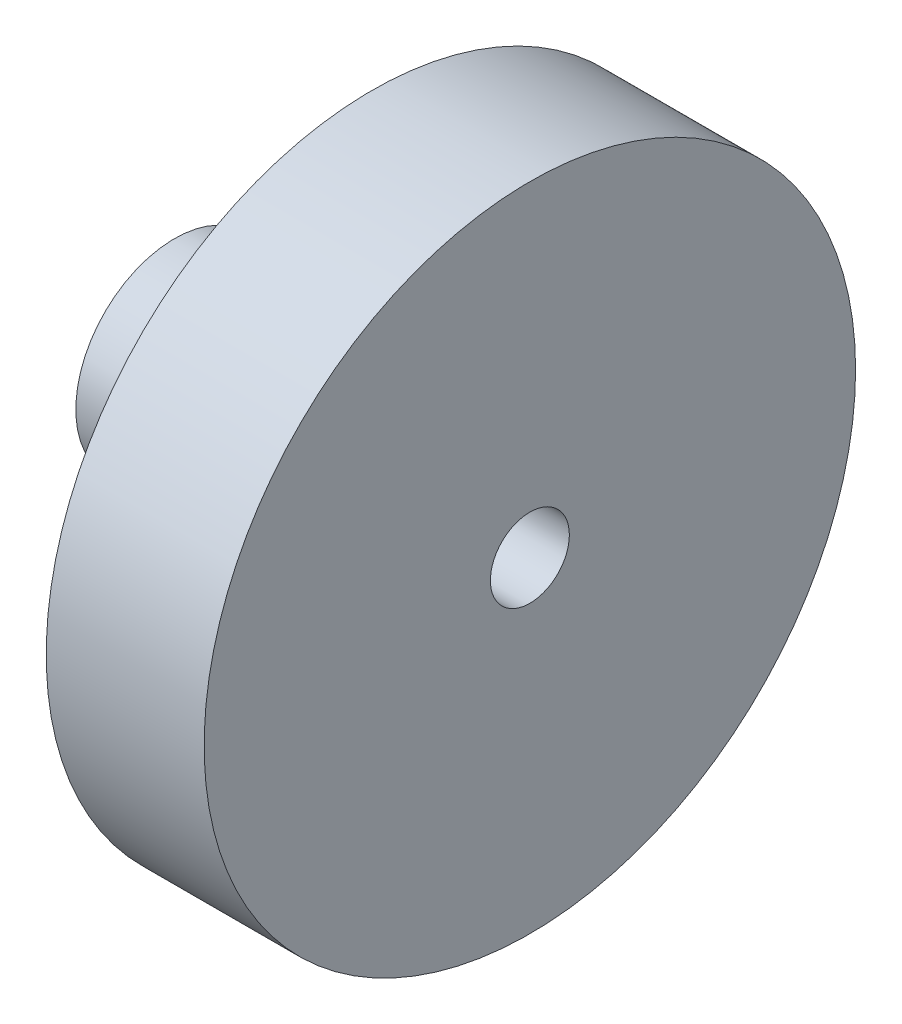
ISO-10303-21;
HEADER;
FILE_DESCRIPTION(('STEP AP214'),'2;1');
FILE_NAME('part.step','',(''),(''),'','','');
FILE_SCHEMA(('AUTOMOTIVE_DESIGN { 1 0 10303 214 1 1 1 1 }'));
ENDSEC;
DATA;
#1=APPLICATION_CONTEXT('core data for automotive mechanical design processes');
#2=APPLICATION_PROTOCOL_DEFINITION('international standard','automotive_design',2000,#1);
#3=PRODUCT_CONTEXT('',#1,'mechanical');
#4=PRODUCT('Part','Part','',(#3));
#5=PRODUCT_RELATED_PRODUCT_CATEGORY('part','',(#4));
#6=PRODUCT_DEFINITION_FORMATION('','',#4);
#7=PRODUCT_DEFINITION_CONTEXT('part definition',#1,'design');
#8=PRODUCT_DEFINITION('design','',#6,#7);
#9=PRODUCT_DEFINITION_SHAPE('','',#8);
#10=(LENGTH_UNIT() NAMED_UNIT(*) SI_UNIT(.MILLI.,.METRE.));
#11=(NAMED_UNIT(*) PLANE_ANGLE_UNIT() SI_UNIT($,.RADIAN.));
#12=(NAMED_UNIT(*) SI_UNIT($,.STERADIAN.) SOLID_ANGLE_UNIT());
#13=UNCERTAINTY_MEASURE_WITH_UNIT(LENGTH_MEASURE(1.E-05),#10,'distance_accuracy_value','');
#14=(GEOMETRIC_REPRESENTATION_CONTEXT(3) GLOBAL_UNCERTAINTY_ASSIGNED_CONTEXT((#13)) GLOBAL_UNIT_ASSIGNED_CONTEXT((#10,
#11,#12)) REPRESENTATION_CONTEXT('',''));
#15=CARTESIAN_POINT('',(0.,0.,0.));
#16=DIRECTION('',(0.,0.,1.));
#17=DIRECTION('',(1.,0.,0.));
#18=AXIS2_PLACEMENT_3D('',#15,#16,#17);
#19=CARTESIAN_POINT('',(0.,0.,0.));
#20=DIRECTION('',(1.,0.,0.));
#21=DIRECTION('',(0.,0.,-1.));
#22=AXIS2_PLACEMENT_3D('',#19,#20,#21);
#23=CYLINDRICAL_SURFACE('',#22,1.99999999999999);
#24=CARTESIAN_POINT('',(-13.45322017837,1.79843682124226,0.874999999999999));
#25=CARTESIAN_POINT('',(-13.4996455668491,1.79844267025872,0.874994185373086));
#26=CARTESIAN_POINT('',(-13.5461362263386,1.80026089575614,0.871281814553723));
#27=CARTESIAN_POINT('',(-13.6377609995906,1.80729814585877,0.856583265673776));
#28=CARTESIAN_POINT('',(-13.6828912938866,1.81252595391355,0.84557829993033));
#29=CARTESIAN_POINT('',(-13.7702976402033,1.8256650779135,0.816819377461344));
#30=CARTESIAN_POINT('',(-13.8125852056156,1.8335646755163,0.799094852047655));
#31=CARTESIAN_POINT('',(-13.8935757385446,1.85114060751144,0.757486974078159));
#32=CARTESIAN_POINT('',(-13.9322792980636,1.86081664768249,0.73360464113771));
#33=CARTESIAN_POINT('',(-14.0076858180357,1.88159814273405,0.67860444231314));
#34=CARTESIAN_POINT('',(-14.0441131990626,1.89275511820233,0.647128046535023));
#35=CARTESIAN_POINT('',(-14.1113783929879,1.91482009276172,0.578584404393027));
#36=CARTESIAN_POINT('',(-14.142213918134,1.92572798836067,0.54151488106822));
#37=CARTESIAN_POINT('',(-14.1988776130539,1.94670307260467,0.460623507148396));
#38=CARTESIAN_POINT('',(-14.2243889001395,1.95670347428988,0.41656077793032));
#39=CARTESIAN_POINT('',(-14.2675157518473,1.97409759337225,0.324251594935387));
#40=CARTESIAN_POINT('',(-14.2851351629206,1.98149258025648,0.276007192994719));
#41=CARTESIAN_POINT('',(-14.3109580815994,1.99247601660861,0.179604041111906));
#42=CARTESIAN_POINT('',(-14.319638658996,1.99625645567351,0.131595413599112));
#43=CARTESIAN_POINT('',(-14.3288859892659,2.00028676065695,0.0346643937267909));
#44=CARTESIAN_POINT('',(-14.3294563937463,2.00053821550072,-0.0142575774637081));
#45=CARTESIAN_POINT('',(-14.3227019762157,1.99759023252614,-0.108130873463996));
#46=CARTESIAN_POINT('',(-14.3159033487893,1.99462077737978,-0.153128695211823));
#47=CARTESIAN_POINT('',(-14.295515053418,1.98588800112158,-0.241269408956307));
#48=CARTESIAN_POINT('',(-14.2819248829422,1.98012447326713,-0.284412163433232));
#49=CARTESIAN_POINT('',(-14.2481883972403,1.96624268291741,-0.368417631333126));
#50=CARTESIAN_POINT('',(-14.2279450345039,1.95808977061224,-0.409235407844303));
#51=CARTESIAN_POINT('',(-14.1815782919894,1.94021222057016,-0.487002053634942));
#52=CARTESIAN_POINT('',(-14.1554527802275,1.93048701331643,-0.523949512986161));
#53=CARTESIAN_POINT('',(-14.095743534564,1.90954741359336,-0.595935871549107));
#54=CARTESIAN_POINT('',(-14.0617419102102,1.89827601276047,-0.630612038356138));
#55=CARTESIAN_POINT('',(-13.9884073903243,1.87605441136165,-0.693936886024361));
#56=CARTESIAN_POINT('',(-13.9490720130834,1.86510436321814,-0.722582745149668));
#57=CARTESIAN_POINT('',(-13.8642488780768,1.84433360774734,-0.774104007572307));
#58=CARTESIAN_POINT('',(-13.8185799874721,1.83457425910816,-0.796708133338992));
#59=CARTESIAN_POINT('',(-13.7235451295974,1.81804057215013,-0.833753424928245));
#60=CARTESIAN_POINT('',(-13.6741821543204,1.81126384804948,-0.848201117652945));
#61=CARTESIAN_POINT('',(-13.5768048279816,1.8020725724064,-0.86754954409033));
#62=CARTESIAN_POINT('',(-13.5289342267471,1.79938817756936,-0.873042695282303));
#63=CARTESIAN_POINT('',(-13.4328901766476,1.79791183626622,-0.876080687797387));
#64=CARTESIAN_POINT('',(-13.3847168599139,1.79911829529383,-0.873628785071821));
#65=CARTESIAN_POINT('',(-13.2931886211794,1.80500670942424,-0.861388170364229));
#66=CARTESIAN_POINT('',(-13.249740356961,1.80942578993547,-0.85215387305427));
#67=CARTESIAN_POINT('',(-13.1650554737938,1.82089297578771,-0.827365600067959));
#68=CARTESIAN_POINT('',(-13.1238194113395,1.82794173912936,-0.81181004259548));
#69=CARTESIAN_POINT('',(-13.0426847429497,1.84425139082008,-0.774064553531829));
#70=CARTESIAN_POINT('',(-13.0029259532811,1.85359632906455,-0.751611624558049));
#71=CARTESIAN_POINT('',(-12.9275374391374,1.87333686493426,-0.700961597965227));
#72=CARTESIAN_POINT('',(-12.8919096333482,1.88373294661273,-0.67276184779974));
#73=CARTESIAN_POINT('',(-12.8223972844785,1.9055511022817,-0.608384071274641));
#74=CARTESIAN_POINT('',(-12.7889703773977,1.91698003267099,-0.571712181701362));
#75=CARTESIAN_POINT('',(-12.7286480364516,1.93870750509733,-0.493028918701698));
#76=CARTESIAN_POINT('',(-12.7017534029818,1.94900590852694,-0.451016891911296));
#77=CARTESIAN_POINT('',(-12.6551778658299,1.96743104077039,-0.36232293883673));
#78=CARTESIAN_POINT('',(-12.6355478993033,1.97554233072842,-0.315610854101785));
#79=CARTESIAN_POINT('',(-12.6045830029,1.98855746644758,-0.219097297225345));
#80=CARTESIAN_POINT('',(-12.5932425737112,1.99346343839954,-0.169297897056046));
#81=CARTESIAN_POINT('',(-12.5799216972897,1.9992481211277,-0.07209118045084));
#82=CARTESIAN_POINT('',(-12.5772979505768,2.00040346809815,-0.0247879798759334));
#83=CARTESIAN_POINT('',(-12.5797156890887,1.99934575386789,0.0695781809476551));
#84=CARTESIAN_POINT('',(-12.5847555731484,1.99713339628286,0.116641189318635));
#85=CARTESIAN_POINT('',(-12.6018970800604,1.98974125718853,0.207139588656076));
#86=CARTESIAN_POINT('',(-12.6136929883777,1.98469010746016,0.250644310304771));
#87=CARTESIAN_POINT('',(-12.6436605807471,1.97220099963069,0.335028608079217));
#88=CARTESIAN_POINT('',(-12.66183340789,1.96476261362741,0.375907711996158));
#89=CARTESIAN_POINT('',(-12.7049588556092,1.94778329676525,0.455950413510898));
#90=CARTESIAN_POINT('',(-12.7301838494413,1.93816167830775,0.494949713940653));
#91=CARTESIAN_POINT('',(-12.7863173209961,1.9179284324557,0.568332496894421));
#92=CARTESIAN_POINT('',(-12.8172281396271,1.90731639818727,0.602714068131048));
#93=CARTESIAN_POINT('',(-12.8866180691496,1.8852720278619,0.668615771310957));
#94=CARTESIAN_POINT('',(-12.92549407957,1.87383871323809,0.699719139890721));
#95=CARTESIAN_POINT('',(-13.008235966694,1.85224037393765,0.755043607534097));
#96=CARTESIAN_POINT('',(-13.0521048360146,1.84207611764286,0.779260548271213));
#97=CARTESIAN_POINT('',(-13.1438407753336,1.82429849284974,0.820019671710732));
#98=CARTESIAN_POINT('',(-13.1917127591117,1.81668831862308,0.836552253811327));
#99=CARTESIAN_POINT('',(-13.2899205481475,1.80518424635639,0.861104681242927));
#100=CARTESIAN_POINT('',(-13.3402474868291,1.80127788482797,0.869153086488734));
#101=CARTESIAN_POINT('',(-13.4116225729651,1.79879556732175,0.874260805643789));
#102=CARTESIAN_POINT('',(-13.4324148213181,1.79843420002831,0.875002605802406));
#103=CARTESIAN_POINT('',(-13.45322017837,1.79843682124226,0.874999999999999));
#104=B_SPLINE_CURVE_WITH_KNOTS('',3,(#24,#25,#26,#27,#28,#29,#30,#31,#32,#33,#34,#35,#36,#37,
#38,#39,#40,#41,#42,#43,#44,#45,#46,#47,#48,#49,#50,#51,#52,#53,#54,#55,#56,#57,#58,#59,#60,#61,
#62,#63,#64,#65,#66,#67,#68,#69,#70,#71,#72,#73,#74,#75,#76,#77,#78,#79,#80,#81,#82,#83,#84,#85,
#86,#87,#88,#89,#90,#91,#92,#93,#94,#95,#96,#97,#98,#99,#100,#101,#102,#103),.UNSPECIFIED.,.T.,
.F.,(4,2,2,2,2,2,2,2,2,2,2,2,2,2,2,2,2,2,2,2,2,2,2,2,2,2,2,2,2,2,2,2,2,2,2,2,2,2,2,4),(0.,
0.139211854544829,0.278783757833573,0.417751277057172,0.556695800673241,0.704311269509711,
0.851986995525496,1.00685254156655,1.16164252475057,1.30765941027075,1.45361054957448,
1.58978716337857,1.72597385487562,1.86424242444373,2.00256119034027,2.1514705177321,
2.30044936949917,2.45528783220658,2.61000221454627,2.75399082716966,2.89792043948698,
3.03123544972419,3.16458384051276,3.30382998316913,3.44314054349794,3.5951953656407,
3.74726880958002,3.90038919363012,4.0534079045894,4.19484840308351,4.33625935442152,
4.47172667892147,4.60721829895103,4.74891487272681,4.8906699154392,5.04321071182055,
5.19584342435713,5.34866632230719,5.50097312018721,5.56336037066704),.UNSPECIFIED.);
#105=CARTESIAN_POINT('',(-13.45322017837,1.79843682124226,0.874999999999999));
#106=VERTEX_POINT('',#105);
#107=EDGE_CURVE('E63',#106,#106,#104,.T.);
#108=ORIENTED_EDGE('',*,*,#107,.F.);
#109=EDGE_LOOP('',(#108));
#110=FACE_BOUND('',#109,.T.);
#111=CARTESIAN_POINT('',(0.,0.,0.));
#112=DIRECTION('',(1.,0.,0.));
#113=DIRECTION('',(0.,0.,-1.));
#114=AXIS2_PLACEMENT_3D('',#111,#112,#113);
#115=CIRCLE('',#114,1.99999999999999);
#116=CARTESIAN_POINT('',(0.,0.,-1.99999999999999));
#117=VERTEX_POINT('',#116);
#118=EDGE_CURVE('E53',#117,#117,#115,.T.);
#119=ORIENTED_EDGE('',*,*,#118,.T.);
#120=EDGE_LOOP('',(#119));
#121=FACE_BOUND('',#120,.T.);
#122=CARTESIAN_POINT('',(-18.,0.,0.));
#123=DIRECTION('',(1.,0.,0.));
#124=DIRECTION('',(0.,0.,-1.));
#125=AXIS2_PLACEMENT_3D('',#122,#123,#124);
#126=CIRCLE('',#125,1.99999999999999);
#127=CARTESIAN_POINT('',(-18.,0.,-1.99999999999999));
#128=VERTEX_POINT('',#127);
#129=EDGE_CURVE('E10',#128,#128,#126,.T.);
#130=ORIENTED_EDGE('',*,*,#129,.F.);
#131=EDGE_LOOP('',(#130));
#132=FACE_BOUND('',#131,.T.);
#133=ADVANCED_FACE('F31',(#110,#121,#132),#23,.F.);
#134=CARTESIAN_POINT('',(-18.,5.,0.));
#135=DIRECTION('',(-1.,0.,0.));
#136=DIRECTION('',(0.,0.,1.));
#137=AXIS2_PLACEMENT_3D('',#134,#135,#136);
#138=PLANE('',#137);
#139=ORIENTED_EDGE('',*,*,#129,.T.);
#140=EDGE_LOOP('',(#139));
#141=FACE_BOUND('',#140,.T.);
#142=CARTESIAN_POINT('',(-18.,0.,0.));
#143=DIRECTION('',(1.,0.,0.));
#144=DIRECTION('',(0.,0.,-1.));
#145=AXIS2_PLACEMENT_3D('',#142,#143,#144);
#146=CIRCLE('',#145,5.);
#147=CARTESIAN_POINT('',(-18.,0.,-5.));
#148=VERTEX_POINT('',#147);
#149=EDGE_CURVE('E37',#148,#148,#146,.T.);
#150=ORIENTED_EDGE('',*,*,#149,.F.);
#151=EDGE_LOOP('',(#150));
#152=FACE_BOUND('',#151,.T.);
#153=ADVANCED_FACE('F90',(#141,#152),#138,.T.);
#154=CARTESIAN_POINT('',(0.,0.,0.));
#155=DIRECTION('',(1.,0.,0.));
#156=DIRECTION('',(0.,0.,-1.));
#157=AXIS2_PLACEMENT_3D('',#154,#155,#156);
#158=CYLINDRICAL_SURFACE('',#157,5.);
#159=CARTESIAN_POINT('',(-13.45322017837,4.9228421668788,0.874999999999999));
#160=CARTESIAN_POINT('',(-13.4044765120783,4.92284307499697,0.874998073539557));
#161=CARTESIAN_POINT('',(-13.3557071366336,4.92357397476884,0.870913147606656));
#162=CARTESIAN_POINT('',(-13.25953938974,4.92641556128211,0.854689981459766));
#163=CARTESIAN_POINT('',(-13.2121422829829,4.92852748100301,0.842544544648483));
#164=CARTESIAN_POINT('',(-13.1201246317655,4.93388475646331,0.810581240433705));
#165=CARTESIAN_POINT('',(-13.0755017036428,4.93712912285695,0.790770068454977));
#166=CARTESIAN_POINT('',(-12.990217100068,4.94438456334799,0.744054765254319));
#167=CARTESIAN_POINT('',(-12.9495550324841,4.94839556143087,0.717151337156948));
#168=CARTESIAN_POINT('',(-12.872900850826,4.95678097185183,0.656703779310403));
#169=CARTESIAN_POINT('',(-12.8369579756245,4.96115853789756,0.623097637866167));
#170=CARTESIAN_POINT('',(-12.7711906584155,4.96975589120863,0.550332633939766));
#171=CARTESIAN_POINT('',(-12.7413665937748,4.97397566872952,0.51117342923396));
#172=CARTESIAN_POINT('',(-12.6884971547799,4.98181553132084,0.428093104045913));
#173=CARTESIAN_POINT('',(-12.6654978435704,4.98543147235489,0.384142246104396));
#174=CARTESIAN_POINT('',(-12.627227119512,4.99162106697564,0.292926899802081));
#175=CARTESIAN_POINT('',(-12.6119551530828,4.99419479522293,0.245662649086159));
#176=CARTESIAN_POINT('',(-12.5897238897306,4.99798770637486,0.149671533158271));
#177=CARTESIAN_POINT('',(-12.5826817462932,4.9992203802933,0.100964396772047));
#178=CARTESIAN_POINT('',(-12.5768522109989,5.00023870350343,0.00304537017441892));
#179=CARTESIAN_POINT('',(-12.5780642031927,5.00002446076855,-0.0461664820998754));
#180=CARTESIAN_POINT('',(-12.5886443402899,4.99818371661764,-0.143130893939201));
#181=CARTESIAN_POINT('',(-12.5979233089294,4.99657265682183,-0.190893519071767));
#182=CARTESIAN_POINT('',(-12.6242333433602,4.99213654894816,-0.284173216176665));
#183=CARTESIAN_POINT('',(-12.6412646637993,4.9893114609923,-0.329690214330628));
#184=CARTESIAN_POINT('',(-12.6826831500164,4.98273861194286,-0.417449271832483));
#185=CARTESIAN_POINT('',(-12.7071066358228,4.9789863122702,-0.459673835906608));
#186=CARTESIAN_POINT('',(-12.7625894937887,4.9709751939494,-0.539458800879953));
#187=CARTESIAN_POINT('',(-12.793649456538,4.96671633023635,-0.577018786200772));
#188=CARTESIAN_POINT('',(-12.8620169805182,4.9580977872857,-0.646935876894303));
#189=CARTESIAN_POINT('',(-12.8994025162358,4.95373752143685,-0.679216709920823));
#190=CARTESIAN_POINT('',(-12.9790983816665,4.9454624226339,-0.737060264743535));
#191=CARTESIAN_POINT('',(-13.0214087663049,4.9415475946486,-0.762622911603708));
#192=CARTESIAN_POINT('',(-13.1098466262571,4.9346060965737,-0.806322044336454));
#193=CARTESIAN_POINT('',(-13.1559790999631,4.93158061381118,-0.824448615268406));
#194=CARTESIAN_POINT('',(-13.2506991598437,4.92677939981509,-0.852673278505629));
#195=CARTESIAN_POINT('',(-13.299286505656,4.92500354648059,-0.862772155207125));
#196=CARTESIAN_POINT('',(-13.3968525932563,4.92292649963477,-0.874545835364773));
#197=CARTESIAN_POINT('',(-13.4458177810996,4.92260621694777,-0.876329694679995));
#198=CARTESIAN_POINT('',(-13.5433467752425,4.92342563856456,-0.871713985213453));
#199=CARTESIAN_POINT('',(-13.5919105986211,4.92456528041931,-0.865314766467179));
#200=CARTESIAN_POINT('',(-13.6869072328927,4.92815844955311,-0.844607784274871));
#201=CARTESIAN_POINT('',(-13.7333526675969,4.93060264449508,-0.830356171120177));
#202=CARTESIAN_POINT('',(-13.8231961777391,4.93652160979565,-0.794408105046443));
#203=CARTESIAN_POINT('',(-13.866594054038,4.93999644742304,-0.772711166165632));
#204=CARTESIAN_POINT('',(-13.9495940049624,4.94762918558854,-0.722233434260734));
#205=CARTESIAN_POINT('',(-13.9891531962878,4.95179364615566,-0.693383138862326));
#206=CARTESIAN_POINT('',(-14.0629081337998,4.96031750209385,-0.629512391964065));
#207=CARTESIAN_POINT('',(-14.0971034620383,4.9646769126213,-0.594491460103899));
#208=CARTESIAN_POINT('',(-14.1595617733834,4.97316022831522,-0.518788866666416));
#209=CARTESIAN_POINT('',(-14.1877517875148,4.97728083740703,-0.478046575925644));
#210=CARTESIAN_POINT('',(-14.236886661375,4.98476842205262,-0.392341011884007));
#211=CARTESIAN_POINT('',(-14.2578317735038,4.98813542385933,-0.347377885699143));
#212=CARTESIAN_POINT('',(-14.2917703974613,4.99372215663664,-0.254717878442439));
#213=CARTESIAN_POINT('',(-14.3048011813031,4.99594725750524,-0.207034986784646));
#214=CARTESIAN_POINT('',(-14.3226608843745,4.99902226336019,-0.110115257508317));
#215=CARTESIAN_POINT('',(-14.3274905507923,4.99987229362628,-0.0608785618702644));
#216=CARTESIAN_POINT('',(-14.3287876723117,5.00009933383322,0.0370486139692459));
#217=CARTESIAN_POINT('',(-14.3253658303017,4.99949584443935,0.0857376177642916));
#218=CARTESIAN_POINT('',(-14.3104976775174,4.99692373636934,0.181835857215835));
#219=CARTESIAN_POINT('',(-14.2990514233488,4.99495512732298,0.229245101897529));
#220=CARTESIAN_POINT('',(-14.2685034917997,4.98987344263051,0.321389465944212));
#221=CARTESIAN_POINT('',(-14.2494121506771,4.98676191269648,0.3661281025404));
#222=CARTESIAN_POINT('',(-14.2041286462827,4.97973294623664,0.451784012491346));
#223=CARTESIAN_POINT('',(-14.1779360914348,4.97581546527185,0.492701074949028));
#224=CARTESIAN_POINT('',(-14.1188055841519,4.96754602270754,0.570107756976131));
#225=CARTESIAN_POINT('',(-14.0857869707684,4.96318921812377,0.606535249660261));
#226=CARTESIAN_POINT('',(-14.0141102726311,4.95456452663817,0.673371254635438));
#227=CARTESIAN_POINT('',(-13.9754508679116,4.95029666081621,0.703778354196428));
#228=CARTESIAN_POINT('',(-13.8932263349826,4.94229651148942,0.757933111841927));
#229=CARTESIAN_POINT('',(-13.8496248873744,4.93856872220172,0.781626301002854));
#230=CARTESIAN_POINT('',(-13.7590117440554,4.93212424297686,0.821314870424466));
#231=CARTESIAN_POINT('',(-13.7120034351501,4.92940656491337,0.837317778102986));
#232=CARTESIAN_POINT('',(-13.6295604452714,4.92587891597868,0.857781628925296));
#233=CARTESIAN_POINT('',(-13.5946189093884,4.92474663101162,0.864227890207769));
#234=CARTESIAN_POINT('',(-13.5241961783149,4.92322793379499,0.872837731365281));
#235=CARTESIAN_POINT('',(-13.4887149946826,4.92284150559315,0.875001402835787));
#236=CARTESIAN_POINT('',(-13.45322017837,4.9228421668788,0.874999999999999));
#237=B_SPLINE_CURVE_WITH_KNOTS('',3,(#159,#160,#161,#162,#163,#164,#165,#166,#167,#168,#169,
#170,#171,#172,#173,#174,#175,#176,#177,#178,#179,#180,#181,#182,#183,#184,#185,#186,#187,#188,
#189,#190,#191,#192,#193,#194,#195,#196,#197,#198,#199,#200,#201,#202,#203,#204,#205,#206,#207,
#208,#209,#210,#211,#212,#213,#214,#215,#216,#217,#218,#219,#220,#221,#222,#223,#224,#225,#226,
#227,#228,#229,#230,#231,#232,#233,#234,#235,#236),.UNSPECIFIED.,.T.,.F.,(4,2,2,2,2,2,2,2,2,2,2,
2,2,2,2,2,2,2,2,2,2,2,2,2,2,2,2,2,2,2,2,2,2,2,2,2,2,2,4),(0.,0.146101164953181,
0.292332947963994,0.438437296117103,0.584527164964141,0.732037167460386,0.879556264642579,
1.02804949490522,1.17653208573414,1.32350671966023,1.47047038600328,1.61582980987728,
1.76119400883468,1.90728435279678,2.05338770297162,2.20144435454404,2.34950265750048,
2.49775773829612,2.64599833111777,2.792289094643,2.93857360071282,3.08382539293052,
3.22908666764115,3.3758187701758,3.5225623002909,3.67099828718693,3.81942910230912,
3.96715535955237,4.11486815701679,4.26061027818323,4.40635137126931,4.55189608218353,
4.69744882037613,4.84483139209219,4.99224850734335,5.14082942553665,5.28926461170158,
5.39565679196015,5.50204669669217),.UNSPECIFIED.);
#238=CARTESIAN_POINT('',(-13.45322017837,4.9228421668788,0.874999999999999));
#239=VERTEX_POINT('',#238);
#240=EDGE_CURVE('E56',#239,#239,#237,.T.);
#241=ORIENTED_EDGE('',*,*,#240,.F.);
#242=EDGE_LOOP('',(#241));
#243=FACE_BOUND('',#242,.T.);
#244=ORIENTED_EDGE('',*,*,#149,.T.);
#245=EDGE_LOOP('',(#244));
#246=FACE_BOUND('',#245,.T.);
#247=CARTESIAN_POINT('',(-8.,0.,0.));
#248=DIRECTION('',(1.,0.,0.));
#249=DIRECTION('',(0.,0.,-1.));
#250=AXIS2_PLACEMENT_3D('',#247,#248,#249);
#251=CIRCLE('',#250,5.);
#252=CARTESIAN_POINT('',(-8.,0.,-5.));
#253=VERTEX_POINT('',#252);
#254=EDGE_CURVE('E41',#253,#253,#251,.T.);
#255=ORIENTED_EDGE('',*,*,#254,.F.);
#256=EDGE_LOOP('',(#255));
#257=FACE_BOUND('',#256,.T.);
#258=ADVANCED_FACE('F67',(#243,#246,#257),#158,.T.);
#259=CARTESIAN_POINT('',(-8.,16.5,0.));
#260=DIRECTION('',(-1.,0.,0.));
#261=DIRECTION('',(0.,0.,1.));
#262=AXIS2_PLACEMENT_3D('',#259,#260,#261);
#263=PLANE('',#262);
#264=ORIENTED_EDGE('',*,*,#254,.T.);
#265=EDGE_LOOP('',(#264));
#266=FACE_BOUND('',#265,.T.);
#267=CARTESIAN_POINT('',(-8.,0.,0.));
#268=DIRECTION('',(1.,0.,0.));
#269=DIRECTION('',(0.,0.,-1.));
#270=AXIS2_PLACEMENT_3D('',#267,#268,#269);
#271=CIRCLE('',#270,16.5);
#272=CARTESIAN_POINT('',(-8.,0.,-16.5));
#273=VERTEX_POINT('',#272);
#274=EDGE_CURVE('E45',#273,#273,#271,.T.);
#275=ORIENTED_EDGE('',*,*,#274,.F.);
#276=EDGE_LOOP('',(#275));
#277=FACE_BOUND('',#276,.T.);
#278=ADVANCED_FACE('F83',(#266,#277),#263,.T.);
#279=CARTESIAN_POINT('',(0.,0.,0.));
#280=DIRECTION('',(1.,0.,0.));
#281=DIRECTION('',(0.,0.,-1.));
#282=AXIS2_PLACEMENT_3D('',#279,#280,#281);
#283=CYLINDRICAL_SURFACE('',#282,16.5);
#284=ORIENTED_EDGE('',*,*,#274,.T.);
#285=EDGE_LOOP('',(#284));
#286=FACE_BOUND('',#285,.T.);
#287=CARTESIAN_POINT('',(0.,0.,0.));
#288=DIRECTION('',(1.,0.,0.));
#289=DIRECTION('',(0.,0.,-1.));
#290=AXIS2_PLACEMENT_3D('',#287,#288,#289);
#291=CIRCLE('',#290,16.5);
#292=CARTESIAN_POINT('',(0.,0.,-16.5));
#293=VERTEX_POINT('',#292);
#294=EDGE_CURVE('E50',#293,#293,#291,.T.);
#295=ORIENTED_EDGE('',*,*,#294,.F.);
#296=EDGE_LOOP('',(#295));
#297=FACE_BOUND('',#296,.T.);
#298=ADVANCED_FACE('F80',(#286,#297),#283,.T.);
#299=CARTESIAN_POINT('',(0.,16.5,0.));
#300=DIRECTION('',(1.,0.,0.));
#301=DIRECTION('',(0.,0.,-1.));
#302=AXIS2_PLACEMENT_3D('',#299,#300,#301);
#303=PLANE('',#302);
#304=ORIENTED_EDGE('',*,*,#294,.T.);
#305=EDGE_LOOP('',(#304));
#306=FACE_BOUND('',#305,.T.);
#307=ORIENTED_EDGE('',*,*,#118,.F.);
#308=EDGE_LOOP('',(#307));
#309=FACE_BOUND('',#308,.T.);
#310=ADVANCED_FACE('F73',(#306,#309),#303,.T.);
#311=CARTESIAN_POINT('',(-13.45322017837,5.,0.));
#312=DIRECTION('',(0.,1.,0.));
#313=DIRECTION('',(0.,0.,1.));
#314=AXIS2_PLACEMENT_3D('',#311,#312,#313);
#315=CYLINDRICAL_SURFACE('',#314,0.874999999999999);
#316=ORIENTED_EDGE('',*,*,#240,.T.);
#317=EDGE_LOOP('',(#316));
#318=FACE_BOUND('',#317,.T.);
#319=ORIENTED_EDGE('',*,*,#107,.T.);
#320=EDGE_LOOP('',(#319));
#321=FACE_BOUND('',#320,.T.);
#322=ADVANCED_FACE('F70',(#318,#321),#315,.F.);
#323=CLOSED_SHELL('',(#133,#153,#258,#278,#298,#310,#322));
#324=MANIFOLD_SOLID_BREP('B2',#323);
#325=ADVANCED_BREP_SHAPE_REPRESENTATION('',(#18,#324),#14);
#326=SHAPE_DEFINITION_REPRESENTATION(#9,#325);
ENDSEC;
END-ISO-10303-21;
